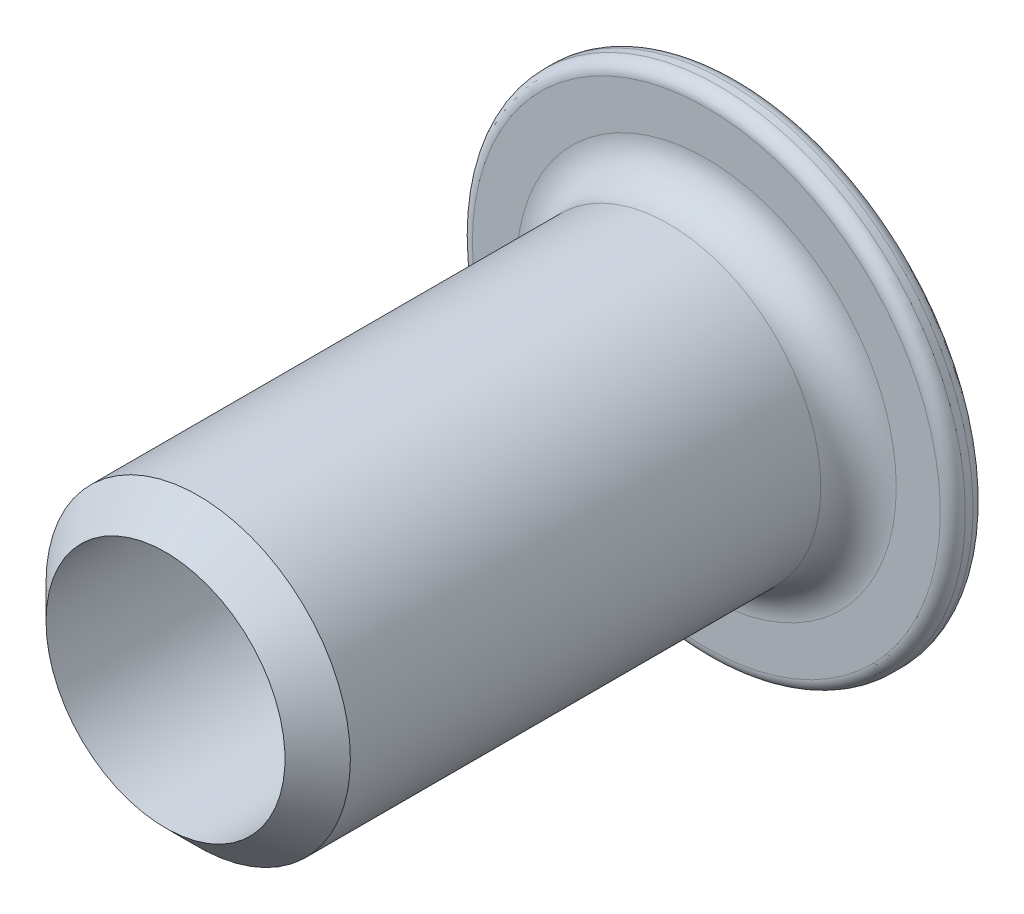
ISO-10303-21;
HEADER;
FILE_DESCRIPTION(('STEP AP214'),'2;1');
FILE_NAME('part.step','',(''),(''),'','','');
FILE_SCHEMA(('AUTOMOTIVE_DESIGN { 1 0 10303 214 1 1 1 1 }'));
ENDSEC;
DATA;
#1=APPLICATION_CONTEXT('core data for automotive mechanical design processes');
#2=APPLICATION_PROTOCOL_DEFINITION('international standard','automotive_design',2000,#1);
#3=PRODUCT_CONTEXT('',#1,'mechanical');
#4=PRODUCT('Part','Part','',(#3));
#5=PRODUCT_RELATED_PRODUCT_CATEGORY('part','',(#4));
#6=PRODUCT_DEFINITION_FORMATION('','',#4);
#7=PRODUCT_DEFINITION_CONTEXT('part definition',#1,'design');
#8=PRODUCT_DEFINITION('design','',#6,#7);
#9=PRODUCT_DEFINITION_SHAPE('','',#8);
#10=(LENGTH_UNIT() NAMED_UNIT(*) SI_UNIT(.MILLI.,.METRE.));
#11=(NAMED_UNIT(*) PLANE_ANGLE_UNIT() SI_UNIT($,.RADIAN.));
#12=(NAMED_UNIT(*) SI_UNIT($,.STERADIAN.) SOLID_ANGLE_UNIT());
#13=UNCERTAINTY_MEASURE_WITH_UNIT(LENGTH_MEASURE(1.E-05),#10,'distance_accuracy_value','');
#14=(GEOMETRIC_REPRESENTATION_CONTEXT(3) GLOBAL_UNCERTAINTY_ASSIGNED_CONTEXT((#13)) GLOBAL_UNIT_ASSIGNED_CONTEXT((#10,
#11,#12)) REPRESENTATION_CONTEXT('',''));
#15=CARTESIAN_POINT('',(0.,0.,0.));
#16=DIRECTION('',(0.,0.,1.));
#17=DIRECTION('',(1.,0.,0.));
#18=AXIS2_PLACEMENT_3D('',#15,#16,#17);
#19=CARTESIAN_POINT('',(0.,0.,0.127));
#20=DIRECTION('',(0.,0.,-1.));
#21=DIRECTION('',(-1.,0.,0.));
#22=AXIS2_PLACEMENT_3D('',#19,#20,#21);
#23=TOROIDAL_SURFACE('',#22,2.3622,0.127);
#24=CARTESIAN_POINT('',(0.,0.,0.));
#25=DIRECTION('',(0.,0.,1.));
#26=DIRECTION('',(-1.,0.,0.));
#27=AXIS2_PLACEMENT_3D('',#24,#25,#26);
#28=CIRCLE('',#27,2.3622);
#29=CARTESIAN_POINT('',(-2.3622,0.,0.));
#30=VERTEX_POINT('',#29);
#31=EDGE_CURVE('E100',#30,#30,#28,.F.);
#32=ORIENTED_EDGE('',*,*,#31,.F.);
#33=EDGE_LOOP('',(#32));
#34=FACE_BOUND('',#33,.T.);
#35=CARTESIAN_POINT('',(0.,0.,0.127));
#36=DIRECTION('',(0.,0.,-1.));
#37=DIRECTION('',(-1.,0.,0.));
#38=AXIS2_PLACEMENT_3D('',#35,#36,#37);
#39=CIRCLE('',#38,2.4892);
#40=CARTESIAN_POINT('',(-2.4892,0.,0.127));
#41=VERTEX_POINT('',#40);
#42=EDGE_CURVE('E96',#41,#41,#39,.F.);
#43=ORIENTED_EDGE('',*,*,#42,.F.);
#44=EDGE_LOOP('',(#43));
#45=FACE_BOUND('',#44,.T.);
#46=ADVANCED_FACE('F14',(#34,#45),#23,.T.);
#47=CARTESIAN_POINT('',(-1.9177,0.,0.));
#48=DIRECTION('',(0.,0.,-1.));
#49=DIRECTION('',(-1.,0.,0.));
#50=AXIS2_PLACEMENT_3D('',#47,#48,#49);
#51=PLANE('',#50);
#52=CARTESIAN_POINT('',(0.,0.,0.));
#53=DIRECTION('',(0.,0.,-1.));
#54=DIRECTION('',(-1.,0.,0.));
#55=AXIS2_PLACEMENT_3D('',#52,#53,#54);
#56=CIRCLE('',#55,1.9177);
#57=CARTESIAN_POINT('',(-1.9177,0.,0.));
#58=VERTEX_POINT('',#57);
#59=EDGE_CURVE('E99',#58,#58,#56,.T.);
#60=ORIENTED_EDGE('',*,*,#59,.F.);
#61=EDGE_LOOP('',(#60));
#62=FACE_BOUND('',#61,.T.);
#63=ORIENTED_EDGE('',*,*,#31,.T.);
#64=EDGE_LOOP('',(#63));
#65=FACE_BOUND('',#64,.T.);
#66=ADVANCED_FACE('F112',(#62,#65),#51,.T.);
#67=CARTESIAN_POINT('',(0.,0.,0.1651));
#68=DIRECTION('',(0.,0.,-1.));
#69=DIRECTION('',(-1.,0.,0.));
#70=AXIS2_PLACEMENT_3D('',#67,#68,#69);
#71=CYLINDRICAL_SURFACE('',#70,2.4892);
#72=ORIENTED_EDGE('',*,*,#42,.T.);
#73=EDGE_LOOP('',(#72));
#74=FACE_BOUND('',#73,.T.);
#75=CARTESIAN_POINT('',(0.,0.,0.2032));
#76=DIRECTION('',(0.,0.,-1.));
#77=DIRECTION('',(-1.,0.,0.));
#78=AXIS2_PLACEMENT_3D('',#75,#76,#77);
#79=CIRCLE('',#78,2.4892);
#80=CARTESIAN_POINT('',(-2.4892,0.,0.2032));
#81=VERTEX_POINT('',#80);
#82=EDGE_CURVE('E66',#81,#81,#79,.F.);
#83=ORIENTED_EDGE('',*,*,#82,.F.);
#84=EDGE_LOOP('',(#83));
#85=FACE_BOUND('',#84,.T.);
#86=ADVANCED_FACE('F120',(#74,#85),#71,.T.);
#87=CARTESIAN_POINT('',(0.,0.,0.7112));
#88=DIRECTION('',(0.,0.,-1.));
#89=DIRECTION('',(-1.,0.,0.));
#90=AXIS2_PLACEMENT_3D('',#87,#88,#89);
#91=TOROIDAL_SURFACE('',#90,1.9177,0.7112);
#92=CARTESIAN_POINT('',(0.,0.,0.7112));
#93=DIRECTION('',(0.,0.,-1.));
#94=DIRECTION('',(-1.,0.,0.));
#95=AXIS2_PLACEMENT_3D('',#92,#93,#94);
#96=CIRCLE('',#95,1.2065);
#97=CARTESIAN_POINT('',(-1.2065,0.,0.7112));
#98=VERTEX_POINT('',#97);
#99=EDGE_CURVE('E57',#98,#98,#96,.F.);
#100=ORIENTED_EDGE('',*,*,#99,.T.);
#101=EDGE_LOOP('',(#100));
#102=FACE_BOUND('',#101,.T.);
#103=ORIENTED_EDGE('',*,*,#59,.T.);
#104=EDGE_LOOP('',(#103));
#105=FACE_BOUND('',#104,.T.);
#106=ADVANCED_FACE('F79',(#102,#105),#91,.T.);
#107=CARTESIAN_POINT('',(0.,0.,0.2032));
#108=DIRECTION('',(0.,0.,-1.));
#109=DIRECTION('',(-1.,0.,0.));
#110=AXIS2_PLACEMENT_3D('',#107,#108,#109);
#111=TOROIDAL_SURFACE('',#110,2.3622,0.126999999999999);
#112=ORIENTED_EDGE('',*,*,#82,.T.);
#113=EDGE_LOOP('',(#112));
#114=FACE_BOUND('',#113,.T.);
#115=CARTESIAN_POINT('',(0.,0.,0.330199999999999));
#116=DIRECTION('',(0.,0.,-1.));
#117=DIRECTION('',(-1.,0.,0.));
#118=AXIS2_PLACEMENT_3D('',#115,#116,#117);
#119=CIRCLE('',#118,2.3622);
#120=CARTESIAN_POINT('',(-2.3622,0.,0.330199999999999));
#121=VERTEX_POINT('',#120);
#122=EDGE_CURVE('E65',#121,#121,#119,.F.);
#123=ORIENTED_EDGE('',*,*,#122,.F.);
#124=EDGE_LOOP('',(#123));
#125=FACE_BOUND('',#124,.T.);
#126=ADVANCED_FACE('F73',(#114,#125),#111,.T.);
#127=CARTESIAN_POINT('',(0.,0.,3.2512));
#128=DIRECTION('',(0.,0.,-1.));
#129=DIRECTION('',(-1.,0.,0.));
#130=AXIS2_PLACEMENT_3D('',#127,#128,#129);
#131=CYLINDRICAL_SURFACE('',#130,1.2065);
#132=CARTESIAN_POINT('',(0.,0.,5.79120000003286));
#133=DIRECTION('',(0.,0.,-1.));
#134=DIRECTION('',(-1.,0.,0.));
#135=AXIS2_PLACEMENT_3D('',#132,#133,#134);
#136=CIRCLE('',#135,1.20649999996658);
#137=CARTESIAN_POINT('',(-1.20649999996658,0.,5.79120000003286));
#138=VERTEX_POINT('',#137);
#139=EDGE_CURVE('E38',#138,#138,#136,.T.);
#140=ORIENTED_EDGE('',*,*,#139,.F.);
#141=EDGE_LOOP('',(#140));
#142=FACE_BOUND('',#141,.T.);
#143=ORIENTED_EDGE('',*,*,#99,.F.);
#144=EDGE_LOOP('',(#143));
#145=FACE_BOUND('',#144,.T.);
#146=ADVANCED_FACE('F78',(#142,#145),#131,.F.);
#147=CARTESIAN_POINT('',(-2.3622,0.,0.3302));
#148=DIRECTION('',(0.,0.,1.));
#149=DIRECTION('',(1.,0.,0.));
#150=AXIS2_PLACEMENT_3D('',#147,#148,#149);
#151=PLANE('',#150);
#152=ORIENTED_EDGE('',*,*,#122,.T.);
#153=EDGE_LOOP('',(#152));
#154=FACE_BOUND('',#153,.T.);
#155=CARTESIAN_POINT('',(0.,0.,0.3302));
#156=DIRECTION('',(0.,0.,1.));
#157=DIRECTION('',(-1.,0.,0.));
#158=AXIS2_PLACEMENT_3D('',#155,#156,#157);
#159=CIRCLE('',#158,1.9177);
#160=CARTESIAN_POINT('',(-1.9177,0.,0.3302));
#161=VERTEX_POINT('',#160);
#162=EDGE_CURVE('E29',#161,#161,#159,.F.);
#163=ORIENTED_EDGE('',*,*,#162,.T.);
#164=EDGE_LOOP('',(#163));
#165=FACE_BOUND('',#164,.T.);
#166=ADVANCED_FACE('F161',(#154,#165),#151,.T.);
#167=CARTESIAN_POINT('',(0.,0.,5.46100000008209));
#168=DIRECTION('',(0.,0.,-1.));
#169=DIRECTION('',(-1.,0.,0.));
#170=AXIS2_PLACEMENT_3D('',#167,#168,#169);
#171=CONICAL_SURFACE('',#170,1.53669999991735,0.785398163397448);
#172=CARTESIAN_POINT('',(0.,0.,5.461));
#173=DIRECTION('',(0.,0.,-1.));
#174=DIRECTION('',(-1.,0.,0.));
#175=AXIS2_PLACEMENT_3D('',#172,#173,#174);
#176=CIRCLE('',#175,1.5367);
#177=CARTESIAN_POINT('',(-1.5367,0.,5.461));
#178=VERTEX_POINT('',#177);
#179=EDGE_CURVE('E24',#178,#178,#176,.T.);
#180=ORIENTED_EDGE('',*,*,#179,.F.);
#181=EDGE_LOOP('',(#180));
#182=FACE_BOUND('',#181,.T.);
#183=ORIENTED_EDGE('',*,*,#139,.T.);
#184=EDGE_LOOP('',(#183));
#185=FACE_BOUND('',#184,.T.);
#186=ADVANCED_FACE('F47',(#182,#185),#171,.T.);
#187=CARTESIAN_POINT('',(0.,0.,0.7112));
#188=DIRECTION('',(0.,0.,-1.));
#189=DIRECTION('',(-1.,0.,0.));
#190=AXIS2_PLACEMENT_3D('',#187,#188,#189);
#191=TOROIDAL_SURFACE('',#190,1.9177,0.381);
#192=ORIENTED_EDGE('',*,*,#162,.F.);
#193=EDGE_LOOP('',(#192));
#194=FACE_BOUND('',#193,.T.);
#195=CARTESIAN_POINT('',(0.,0.,0.7112));
#196=DIRECTION('',(0.,0.,-1.));
#197=DIRECTION('',(-1.,0.,0.));
#198=AXIS2_PLACEMENT_3D('',#195,#196,#197);
#199=CIRCLE('',#198,1.5367);
#200=CARTESIAN_POINT('',(-1.5367,0.,0.7112));
#201=VERTEX_POINT('',#200);
#202=EDGE_CURVE('E10',#201,#201,#199,.F.);
#203=ORIENTED_EDGE('',*,*,#202,.F.);
#204=EDGE_LOOP('',(#203));
#205=FACE_BOUND('',#204,.T.);
#206=ADVANCED_FACE('F41',(#194,#205),#191,.F.);
#207=CARTESIAN_POINT('',(0.,0.,1.01146839660544));
#208=DIRECTION('',(0.,0.,-1.));
#209=DIRECTION('',(-1.,0.,0.));
#210=AXIS2_PLACEMENT_3D('',#207,#208,#209);
#211=CYLINDRICAL_SURFACE('',#210,1.5367);
#212=ORIENTED_EDGE('',*,*,#202,.T.);
#213=EDGE_LOOP('',(#212));
#214=FACE_BOUND('',#213,.T.);
#215=ORIENTED_EDGE('',*,*,#179,.T.);
#216=EDGE_LOOP('',(#215));
#217=FACE_BOUND('',#216,.T.);
#218=ADVANCED_FACE('F46',(#214,#217),#211,.T.);
#219=CLOSED_SHELL('',(#46,#66,#86,#106,#126,#146,#166,#186,#206,#218));
#220=MANIFOLD_SOLID_BREP('B1',#219);
#221=ADVANCED_BREP_SHAPE_REPRESENTATION('',(#18,#220),#14);
#222=SHAPE_DEFINITION_REPRESENTATION(#9,#221);
ENDSEC;
END-ISO-10303-21;
